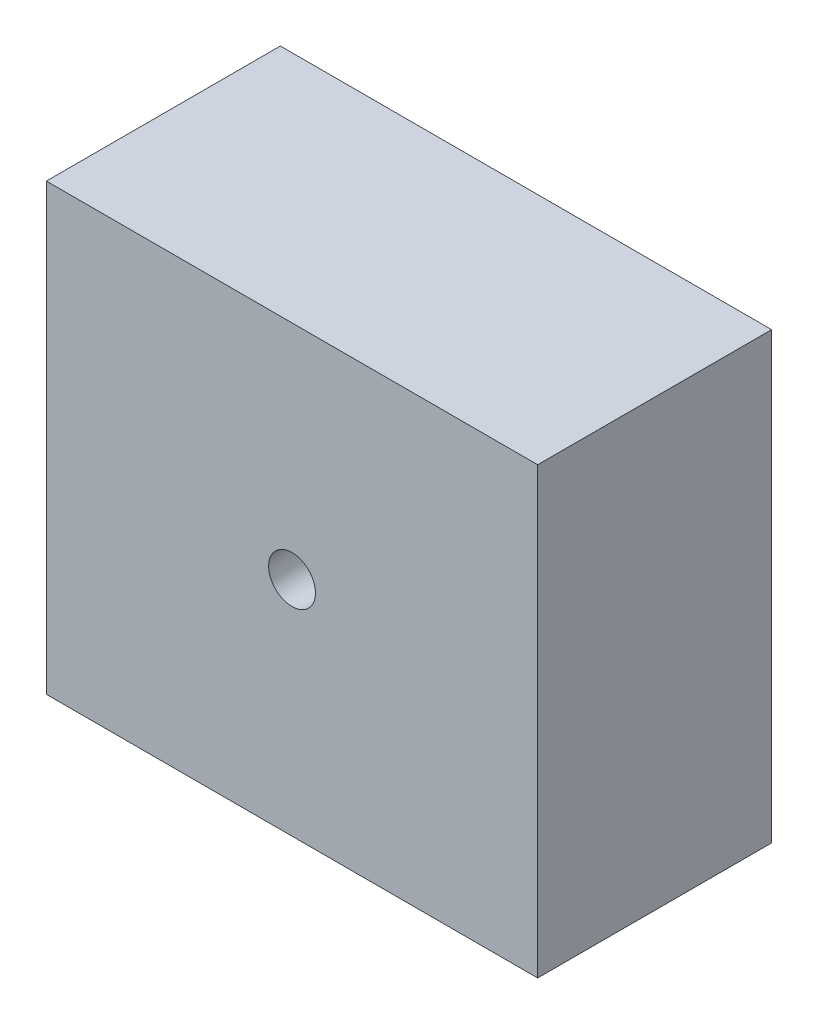
ISO-10303-21;
HEADER;
FILE_DESCRIPTION(('STEP AP214'),'2;1');
FILE_NAME('part.step','',(''),(''),'','','');
FILE_SCHEMA(('AUTOMOTIVE_DESIGN { 1 0 10303 214 1 1 1 1 }'));
ENDSEC;
DATA;
#1=APPLICATION_CONTEXT('core data for automotive mechanical design processes');
#2=APPLICATION_PROTOCOL_DEFINITION('international standard','automotive_design',2000,#1);
#3=PRODUCT_CONTEXT('',#1,'mechanical');
#4=PRODUCT('Part','Part','',(#3));
#5=PRODUCT_RELATED_PRODUCT_CATEGORY('part','',(#4));
#6=PRODUCT_DEFINITION_FORMATION('','',#4);
#7=PRODUCT_DEFINITION_CONTEXT('part definition',#1,'design');
#8=PRODUCT_DEFINITION('design','',#6,#7);
#9=PRODUCT_DEFINITION_SHAPE('','',#8);
#10=(LENGTH_UNIT() NAMED_UNIT(*) SI_UNIT(.MILLI.,.METRE.));
#11=(NAMED_UNIT(*) PLANE_ANGLE_UNIT() SI_UNIT($,.RADIAN.));
#12=(NAMED_UNIT(*) SI_UNIT($,.STERADIAN.) SOLID_ANGLE_UNIT());
#13=UNCERTAINTY_MEASURE_WITH_UNIT(LENGTH_MEASURE(1.E-05),#10,'distance_accuracy_value','');
#14=(GEOMETRIC_REPRESENTATION_CONTEXT(3) GLOBAL_UNCERTAINTY_ASSIGNED_CONTEXT((#13)) GLOBAL_UNIT_ASSIGNED_CONTEXT((#10,
#11,#12)) REPRESENTATION_CONTEXT('',''));
#15=CARTESIAN_POINT('',(0.,0.,0.));
#16=DIRECTION('',(0.,0.,1.));
#17=DIRECTION('',(1.,0.,0.));
#18=AXIS2_PLACEMENT_3D('',#15,#16,#17);
#19=CARTESIAN_POINT('',(10.5,-9.5,10.));
#20=DIRECTION('',(-1.,0.,0.));
#21=DIRECTION('',(0.,0.,1.));
#22=AXIS2_PLACEMENT_3D('',#19,#20,#21);
#23=PLANE('',#22);
#24=DIRECTION('',(0.,1.,0.));
#25=VECTOR('',#24,1.);
#26=CARTESIAN_POINT('',(10.5,-9.5,0.));
#27=LINE('',#26,#25);
#28=CARTESIAN_POINT('',(10.5,-9.5,0.));
#29=VERTEX_POINT('',#28);
#30=CARTESIAN_POINT('',(10.5,9.5,0.));
#31=VERTEX_POINT('',#30);
#32=EDGE_CURVE('E143',#29,#31,#27,.T.);
#33=ORIENTED_EDGE('',*,*,#32,.T.);
#34=DIRECTION('',(0.,0.,-1.));
#35=VECTOR('',#34,1.);
#36=CARTESIAN_POINT('',(10.5,9.5,10.));
#37=LINE('',#36,#35);
#38=CARTESIAN_POINT('',(10.5,9.5,10.));
#39=VERTEX_POINT('',#38);
#40=EDGE_CURVE('E11',#39,#31,#37,.T.);
#41=ORIENTED_EDGE('',*,*,#40,.F.);
#42=DIRECTION('',(0.,1.,0.));
#43=VECTOR('',#42,1.);
#44=CARTESIAN_POINT('',(10.5,-9.5,10.));
#45=LINE('',#44,#43);
#46=CARTESIAN_POINT('',(10.5,-9.5,10.));
#47=VERTEX_POINT('',#46);
#48=EDGE_CURVE('E147',#47,#39,#45,.T.);
#49=ORIENTED_EDGE('',*,*,#48,.F.);
#50=DIRECTION('',(0.,0.,-1.));
#51=VECTOR('',#50,1.);
#52=CARTESIAN_POINT('',(10.5,-9.5,10.));
#53=LINE('',#52,#51);
#54=EDGE_CURVE('E153',#47,#29,#53,.T.);
#55=ORIENTED_EDGE('',*,*,#54,.T.);
#56=EDGE_LOOP('',(#33,#41,#49,#55));
#57=FACE_BOUND('',#56,.T.);
#58=ADVANCED_FACE('F32',(#57),#23,.F.);
#59=CARTESIAN_POINT('',(-10.5,9.5,10.));
#60=DIRECTION('',(0.,-1.,0.));
#61=DIRECTION('',(0.,0.,-1.));
#62=AXIS2_PLACEMENT_3D('',#59,#60,#61);
#63=PLANE('',#62);
#64=DIRECTION('',(-1.,0.,0.));
#65=VECTOR('',#64,1.);
#66=CARTESIAN_POINT('',(-10.5,9.5,0.));
#67=LINE('',#66,#65);
#68=CARTESIAN_POINT('',(-10.5,9.5,0.));
#69=VERTEX_POINT('',#68);
#70=EDGE_CURVE('E156',#31,#69,#67,.T.);
#71=ORIENTED_EDGE('',*,*,#70,.T.);
#72=DIRECTION('',(0.,0.,-1.));
#73=VECTOR('',#72,1.);
#74=CARTESIAN_POINT('',(-10.5,9.5,10.));
#75=LINE('',#74,#73);
#76=CARTESIAN_POINT('',(-10.5,9.5,10.));
#77=VERTEX_POINT('',#76);
#78=EDGE_CURVE('E39',#77,#69,#75,.T.);
#79=ORIENTED_EDGE('',*,*,#78,.F.);
#80=DIRECTION('',(-1.,0.,0.));
#81=VECTOR('',#80,1.);
#82=CARTESIAN_POINT('',(-10.5,9.5,10.));
#83=LINE('',#82,#81);
#84=EDGE_CURVE('E83',#39,#77,#83,.T.);
#85=ORIENTED_EDGE('',*,*,#84,.F.);
#86=ORIENTED_EDGE('',*,*,#40,.T.);
#87=EDGE_LOOP('',(#71,#79,#85,#86));
#88=FACE_BOUND('',#87,.T.);
#89=ADVANCED_FACE('F185',(#88),#63,.F.);
#90=CARTESIAN_POINT('',(-10.5,-9.5,10.));
#91=DIRECTION('',(1.,0.,0.));
#92=DIRECTION('',(0.,0.,-1.));
#93=AXIS2_PLACEMENT_3D('',#90,#91,#92);
#94=PLANE('',#93);
#95=DIRECTION('',(0.,-1.,0.));
#96=VECTOR('',#95,1.);
#97=CARTESIAN_POINT('',(-10.5,-9.5,0.));
#98=LINE('',#97,#96);
#99=CARTESIAN_POINT('',(-10.5,-9.5,0.));
#100=VERTEX_POINT('',#99);
#101=EDGE_CURVE('E158',#69,#100,#98,.T.);
#102=ORIENTED_EDGE('',*,*,#101,.T.);
#103=DIRECTION('',(0.,0.,-1.));
#104=VECTOR('',#103,1.);
#105=CARTESIAN_POINT('',(-10.5,-9.5,10.));
#106=LINE('',#105,#104);
#107=CARTESIAN_POINT('',(-10.5,-9.5,10.));
#108=VERTEX_POINT('',#107);
#109=EDGE_CURVE('E162',#108,#100,#106,.T.);
#110=ORIENTED_EDGE('',*,*,#109,.F.);
#111=DIRECTION('',(0.,-1.,0.));
#112=VECTOR('',#111,1.);
#113=CARTESIAN_POINT('',(-10.5,-9.5,10.));
#114=LINE('',#113,#112);
#115=EDGE_CURVE('E150',#77,#108,#114,.T.);
#116=ORIENTED_EDGE('',*,*,#115,.F.);
#117=ORIENTED_EDGE('',*,*,#78,.T.);
#118=EDGE_LOOP('',(#102,#110,#116,#117));
#119=FACE_BOUND('',#118,.T.);
#120=ADVANCED_FACE('F167',(#119),#94,.F.);
#121=CARTESIAN_POINT('',(-10.5,-9.5,10.));
#122=DIRECTION('',(0.,1.,0.));
#123=DIRECTION('',(0.,0.,1.));
#124=AXIS2_PLACEMENT_3D('',#121,#122,#123);
#125=PLANE('',#124);
#126=DIRECTION('',(1.,0.,0.));
#127=VECTOR('',#126,1.);
#128=CARTESIAN_POINT('',(-10.5,-9.5,0.));
#129=LINE('',#128,#127);
#130=EDGE_CURVE('E76',#100,#29,#129,.T.);
#131=ORIENTED_EDGE('',*,*,#130,.T.);
#132=ORIENTED_EDGE('',*,*,#54,.F.);
#133=DIRECTION('',(1.,0.,0.));
#134=VECTOR('',#133,1.);
#135=CARTESIAN_POINT('',(-10.5,-9.5,10.));
#136=LINE('',#135,#134);
#137=EDGE_CURVE('E55',#108,#47,#136,.T.);
#138=ORIENTED_EDGE('',*,*,#137,.F.);
#139=ORIENTED_EDGE('',*,*,#109,.T.);
#140=EDGE_LOOP('',(#131,#132,#138,#139));
#141=FACE_BOUND('',#140,.T.);
#142=ADVANCED_FACE('F175',(#141),#125,.F.);
#143=CARTESIAN_POINT('',(0.,0.,10.));
#144=DIRECTION('',(0.,0.,-1.));
#145=DIRECTION('',(-1.,0.,0.));
#146=AXIS2_PLACEMENT_3D('',#143,#144,#145);
#147=PLANE('',#146);
#148=CARTESIAN_POINT('',(0.,0.,10.));
#149=DIRECTION('',(0.,0.,-1.));
#150=DIRECTION('',(-1.,0.,0.));
#151=AXIS2_PLACEMENT_3D('',#148,#149,#150);
#152=CIRCLE('',#151,1.);
#153=CARTESIAN_POINT('',(-1.,0.,10.));
#154=VERTEX_POINT('',#153);
#155=EDGE_CURVE('E131',#154,#154,#152,.T.);
#156=ORIENTED_EDGE('',*,*,#155,.T.);
#157=EDGE_LOOP('',(#156));
#158=FACE_BOUND('',#157,.T.);
#159=ORIENTED_EDGE('',*,*,#48,.T.);
#160=ORIENTED_EDGE('',*,*,#84,.T.);
#161=ORIENTED_EDGE('',*,*,#115,.T.);
#162=ORIENTED_EDGE('',*,*,#137,.T.);
#163=EDGE_LOOP('',(#159,#160,#161,#162));
#164=FACE_BOUND('',#163,.T.);
#165=ADVANCED_FACE('F177',(#158,#164),#147,.F.);
#166=CARTESIAN_POINT('',(0.,0.,0.));
#167=DIRECTION('',(0.,0.,-1.));
#168=DIRECTION('',(-1.,0.,0.));
#169=AXIS2_PLACEMENT_3D('',#166,#167,#168);
#170=PLANE('',#169);
#171=DIRECTION('',(0.,-1.,0.));
#172=VECTOR('',#171,1.);
#173=CARTESIAN_POINT('',(8.1,-7.1,0.));
#174=LINE('',#173,#172);
#175=CARTESIAN_POINT('',(8.1,7.1,0.));
#176=VERTEX_POINT('',#175);
#177=CARTESIAN_POINT('',(8.1,-7.1,0.));
#178=VERTEX_POINT('',#177);
#179=EDGE_CURVE('E46',#176,#178,#174,.T.);
#180=ORIENTED_EDGE('',*,*,#179,.F.);
#181=DIRECTION('',(1.,0.,0.));
#182=VECTOR('',#181,1.);
#183=CARTESIAN_POINT('',(-8.1,7.1,0.));
#184=LINE('',#183,#182);
#185=CARTESIAN_POINT('',(-8.1,7.1,0.));
#186=VERTEX_POINT('',#185);
#187=EDGE_CURVE('E125',#186,#176,#184,.T.);
#188=ORIENTED_EDGE('',*,*,#187,.F.);
#189=DIRECTION('',(0.,1.,0.));
#190=VECTOR('',#189,1.);
#191=CARTESIAN_POINT('',(-8.1,-7.1,0.));
#192=LINE('',#191,#190);
#193=CARTESIAN_POINT('',(-8.1,-7.1,0.));
#194=VERTEX_POINT('',#193);
#195=EDGE_CURVE('E128',#194,#186,#192,.T.);
#196=ORIENTED_EDGE('',*,*,#195,.F.);
#197=DIRECTION('',(-1.,0.,0.));
#198=VECTOR('',#197,1.);
#199=CARTESIAN_POINT('',(-8.1,-7.1,0.));
#200=LINE('',#199,#198);
#201=EDGE_CURVE('E137',#178,#194,#200,.T.);
#202=ORIENTED_EDGE('',*,*,#201,.F.);
#203=EDGE_LOOP('',(#180,#188,#196,#202));
#204=FACE_BOUND('',#203,.T.);
#205=ORIENTED_EDGE('',*,*,#32,.F.);
#206=ORIENTED_EDGE('',*,*,#130,.F.);
#207=ORIENTED_EDGE('',*,*,#101,.F.);
#208=ORIENTED_EDGE('',*,*,#70,.F.);
#209=EDGE_LOOP('',(#205,#206,#207,#208));
#210=FACE_BOUND('',#209,.T.);
#211=ADVANCED_FACE('F171',(#204,#210),#170,.T.);
#212=CARTESIAN_POINT('',(8.1,-7.1,2.01927938709344));
#213=DIRECTION('',(1.,0.,0.));
#214=DIRECTION('',(0.,0.,-1.));
#215=AXIS2_PLACEMENT_3D('',#212,#213,#214);
#216=PLANE('',#215);
#217=ORIENTED_EDGE('',*,*,#179,.T.);
#218=DIRECTION('',(0.,0.,-1.));
#219=VECTOR('',#218,1.);
#220=CARTESIAN_POINT('',(8.1,-7.1,2.01927938709344));
#221=LINE('',#220,#219);
#222=CARTESIAN_POINT('',(8.1,-7.1,2.01927938709344));
#223=VERTEX_POINT('',#222);
#224=EDGE_CURVE('E103',#223,#178,#221,.T.);
#225=ORIENTED_EDGE('',*,*,#224,.F.);
#226=DIRECTION('',(0.,-1.,0.));
#227=VECTOR('',#226,1.);
#228=CARTESIAN_POINT('',(8.1,-7.1,2.01927938709344));
#229=LINE('',#228,#227);
#230=CARTESIAN_POINT('',(8.1,7.1,2.01927938709344));
#231=VERTEX_POINT('',#230);
#232=EDGE_CURVE('E107',#231,#223,#229,.T.);
#233=ORIENTED_EDGE('',*,*,#232,.F.);
#234=DIRECTION('',(0.,0.,-1.));
#235=VECTOR('',#234,1.);
#236=CARTESIAN_POINT('',(8.1,7.1,2.01927938709344));
#237=LINE('',#236,#235);
#238=EDGE_CURVE('E141',#231,#176,#237,.T.);
#239=ORIENTED_EDGE('',*,*,#238,.T.);
#240=EDGE_LOOP('',(#217,#225,#233,#239));
#241=FACE_BOUND('',#240,.T.);
#242=ADVANCED_FACE('F105',(#241),#216,.F.);
#243=CARTESIAN_POINT('',(-8.1,7.1,2.01927938709344));
#244=DIRECTION('',(0.,1.,0.));
#245=DIRECTION('',(-1.,0.,0.));
#246=AXIS2_PLACEMENT_3D('',#243,#244,#245);
#247=PLANE('',#246);
#248=ORIENTED_EDGE('',*,*,#187,.T.);
#249=ORIENTED_EDGE('',*,*,#238,.F.);
#250=DIRECTION('',(1.,0.,0.));
#251=VECTOR('',#250,1.);
#252=CARTESIAN_POINT('',(-8.1,7.1,2.01927938709344));
#253=LINE('',#252,#251);
#254=CARTESIAN_POINT('',(-8.1,7.1,2.01927938709344));
#255=VERTEX_POINT('',#254);
#256=EDGE_CURVE('E113',#255,#231,#253,.T.);
#257=ORIENTED_EDGE('',*,*,#256,.F.);
#258=DIRECTION('',(0.,0.,-1.));
#259=VECTOR('',#258,1.);
#260=CARTESIAN_POINT('',(-8.1,7.1,2.01927938709344));
#261=LINE('',#260,#259);
#262=EDGE_CURVE('E144',#255,#186,#261,.T.);
#263=ORIENTED_EDGE('',*,*,#262,.T.);
#264=EDGE_LOOP('',(#248,#249,#257,#263));
#265=FACE_BOUND('',#264,.T.);
#266=ADVANCED_FACE('F220',(#265),#247,.F.);
#267=CARTESIAN_POINT('',(-8.1,-7.1,2.01927938709344));
#268=DIRECTION('',(-1.,0.,0.));
#269=DIRECTION('',(0.,0.,1.));
#270=AXIS2_PLACEMENT_3D('',#267,#268,#269);
#271=PLANE('',#270);
#272=ORIENTED_EDGE('',*,*,#195,.T.);
#273=ORIENTED_EDGE('',*,*,#262,.F.);
#274=DIRECTION('',(0.,1.,0.));
#275=VECTOR('',#274,1.);
#276=CARTESIAN_POINT('',(-8.1,-7.1,2.01927938709344));
#277=LINE('',#276,#275);
#278=CARTESIAN_POINT('',(-8.1,-7.1,2.01927938709344));
#279=VERTEX_POINT('',#278);
#280=EDGE_CURVE('E121',#279,#255,#277,.T.);
#281=ORIENTED_EDGE('',*,*,#280,.F.);
#282=DIRECTION('',(0.,0.,-1.));
#283=VECTOR('',#282,1.);
#284=CARTESIAN_POINT('',(-8.1,-7.1,2.01927938709344));
#285=LINE('',#284,#283);
#286=EDGE_CURVE('E112',#279,#194,#285,.T.);
#287=ORIENTED_EDGE('',*,*,#286,.T.);
#288=EDGE_LOOP('',(#272,#273,#281,#287));
#289=FACE_BOUND('',#288,.T.);
#290=ADVANCED_FACE('F229',(#289),#271,.F.);
#291=CARTESIAN_POINT('',(-8.1,-7.1,2.01927938709344));
#292=DIRECTION('',(0.,-1.,0.));
#293=DIRECTION('',(1.,0.,0.));
#294=AXIS2_PLACEMENT_3D('',#291,#292,#293);
#295=PLANE('',#294);
#296=ORIENTED_EDGE('',*,*,#201,.T.);
#297=ORIENTED_EDGE('',*,*,#286,.F.);
#298=DIRECTION('',(-1.,0.,0.));
#299=VECTOR('',#298,1.);
#300=CARTESIAN_POINT('',(-8.1,-7.1,2.01927938709344));
#301=LINE('',#300,#299);
#302=EDGE_CURVE('E116',#223,#279,#301,.T.);
#303=ORIENTED_EDGE('',*,*,#302,.F.);
#304=ORIENTED_EDGE('',*,*,#224,.T.);
#305=EDGE_LOOP('',(#296,#297,#303,#304));
#306=FACE_BOUND('',#305,.T.);
#307=ADVANCED_FACE('F117',(#306),#295,.F.);
#308=CARTESIAN_POINT('',(0.,0.,2.01927938709344));
#309=DIRECTION('',(0.,0.,-1.));
#310=DIRECTION('',(-1.,0.,0.));
#311=AXIS2_PLACEMENT_3D('',#308,#309,#310);
#312=PLANE('',#311);
#313=CARTESIAN_POINT('',(0.,0.,2.01927938709344));
#314=DIRECTION('',(0.,0.,-1.));
#315=DIRECTION('',(-1.,0.,0.));
#316=AXIS2_PLACEMENT_3D('',#313,#314,#315);
#317=CIRCLE('',#316,1.);
#318=CARTESIAN_POINT('',(-1.,0.,2.01927938709344));
#319=VERTEX_POINT('',#318);
#320=EDGE_CURVE('E278',#319,#319,#317,.T.);
#321=ORIENTED_EDGE('',*,*,#320,.F.);
#322=EDGE_LOOP('',(#321));
#323=FACE_BOUND('',#322,.T.);
#324=ORIENTED_EDGE('',*,*,#232,.T.);
#325=ORIENTED_EDGE('',*,*,#302,.T.);
#326=ORIENTED_EDGE('',*,*,#280,.T.);
#327=ORIENTED_EDGE('',*,*,#256,.T.);
#328=EDGE_LOOP('',(#324,#325,#326,#327));
#329=FACE_BOUND('',#328,.T.);
#330=ADVANCED_FACE('F123',(#323,#329),#312,.T.);
#331=CARTESIAN_POINT('',(0.,0.,10.0192793870934));
#332=DIRECTION('',(0.,0.,-1.));
#333=DIRECTION('',(-1.,0.,0.));
#334=AXIS2_PLACEMENT_3D('',#331,#332,#333);
#335=CYLINDRICAL_SURFACE('',#334,1.);
#336=ORIENTED_EDGE('',*,*,#320,.T.);
#337=EDGE_LOOP('',(#336));
#338=FACE_BOUND('',#337,.T.);
#339=ORIENTED_EDGE('',*,*,#155,.F.);
#340=EDGE_LOOP('',(#339));
#341=FACE_BOUND('',#340,.T.);
#342=ADVANCED_FACE('F261',(#338,#341),#335,.F.);
#343=CLOSED_SHELL('',(#58,#89,#120,#142,#165,#211,#242,#266,#290,#307,#330,#342));
#344=MANIFOLD_SOLID_BREP('B2',#343);
#345=ADVANCED_BREP_SHAPE_REPRESENTATION('',(#18,#344),#14);
#346=SHAPE_DEFINITION_REPRESENTATION(#9,#345);
ENDSEC;
END-ISO-10303-21;
